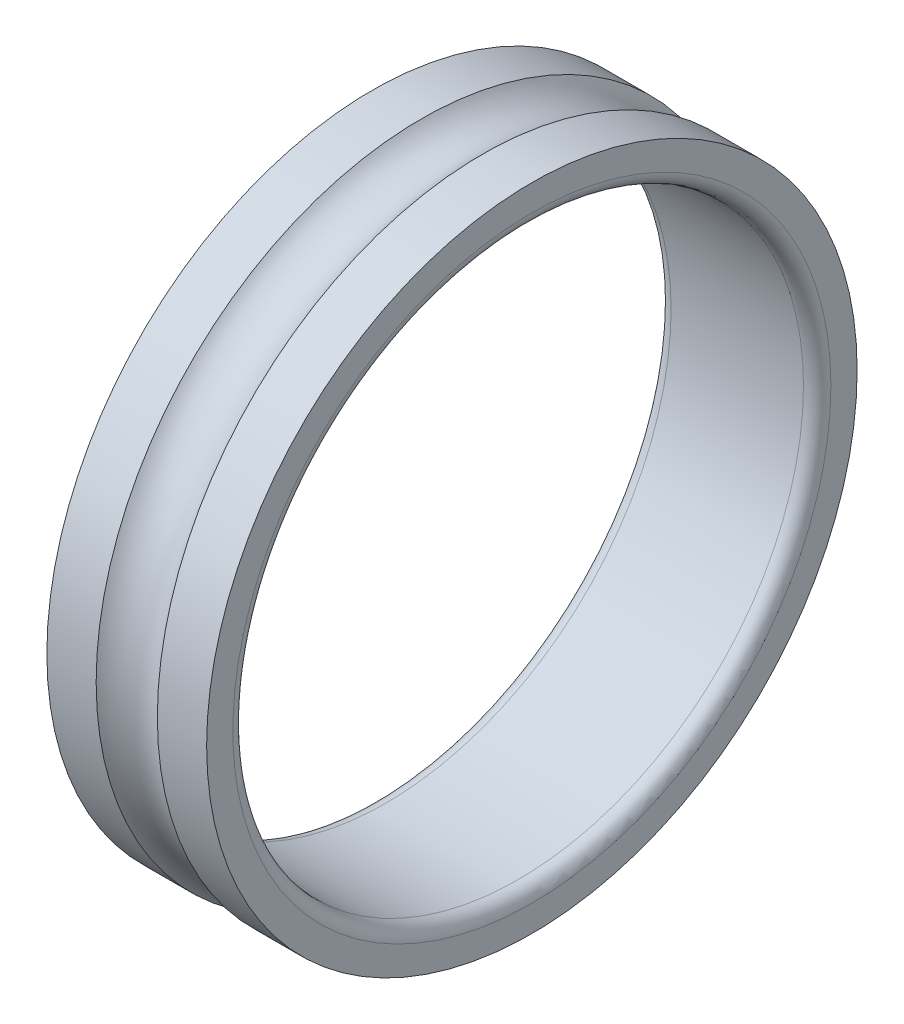
ISO-10303-21;
HEADER;
FILE_DESCRIPTION(('STEP AP214'),'2;1');
FILE_NAME('part.step','',(''),(''),'','','');
FILE_SCHEMA(('AUTOMOTIVE_DESIGN { 1 0 10303 214 1 1 1 1 }'));
ENDSEC;
DATA;
#1=APPLICATION_CONTEXT('core data for automotive mechanical design processes');
#2=APPLICATION_PROTOCOL_DEFINITION('international standard','automotive_design',2000,#1);
#3=PRODUCT_CONTEXT('',#1,'mechanical');
#4=PRODUCT('Part','Part','',(#3));
#5=PRODUCT_RELATED_PRODUCT_CATEGORY('part','',(#4));
#6=PRODUCT_DEFINITION_FORMATION('','',#4);
#7=PRODUCT_DEFINITION_CONTEXT('part definition',#1,'design');
#8=PRODUCT_DEFINITION('design','',#6,#7);
#9=PRODUCT_DEFINITION_SHAPE('','',#8);
#10=(LENGTH_UNIT() NAMED_UNIT(*) SI_UNIT(.MILLI.,.METRE.));
#11=(NAMED_UNIT(*) PLANE_ANGLE_UNIT() SI_UNIT($,.RADIAN.));
#12=(NAMED_UNIT(*) SI_UNIT($,.STERADIAN.) SOLID_ANGLE_UNIT());
#13=UNCERTAINTY_MEASURE_WITH_UNIT(LENGTH_MEASURE(1.E-05),#10,'distance_accuracy_value','');
#14=(GEOMETRIC_REPRESENTATION_CONTEXT(3) GLOBAL_UNCERTAINTY_ASSIGNED_CONTEXT((#13)) GLOBAL_UNIT_ASSIGNED_CONTEXT((#10,
#11,#12)) REPRESENTATION_CONTEXT('',''));
#15=CARTESIAN_POINT('',(0.,0.,0.));
#16=DIRECTION('',(0.,0.,1.));
#17=DIRECTION('',(1.,0.,0.));
#18=AXIS2_PLACEMENT_3D('',#15,#16,#17);
#19=CARTESIAN_POINT('',(3.5,0.,0.));
#20=DIRECTION('',(1.,0.,0.));
#21=DIRECTION('',(0.,0.,-1.));
#22=AXIS2_PLACEMENT_3D('',#19,#20,#21);
#23=TOROIDAL_SURFACE('',#22,15.375,1.75);
#24=CARTESIAN_POINT('',(2.15952433815455,0.,0.));
#25=DIRECTION('',(-1.,0.,0.));
#26=DIRECTION('',(0.,0.,1.));
#27=AXIS2_PLACEMENT_3D('',#24,#25,#26);
#28=CIRCLE('',#27,14.25);
#29=CARTESIAN_POINT('',(2.15952433815455,0.,14.25));
#30=VERTEX_POINT('',#29);
#31=EDGE_CURVE('E109',#30,#30,#28,.T.);
#32=ORIENTED_EDGE('',*,*,#31,.F.);
#33=EDGE_LOOP('',(#32));
#34=FACE_BOUND('',#33,.T.);
#35=CARTESIAN_POINT('',(4.84047566184545,0.,0.));
#36=DIRECTION('',(-1.,0.,0.));
#37=DIRECTION('',(0.,0.,1.));
#38=AXIS2_PLACEMENT_3D('',#35,#36,#37);
#39=CIRCLE('',#38,14.25);
#40=CARTESIAN_POINT('',(4.84047566184545,0.,14.25));
#41=VERTEX_POINT('',#40);
#42=EDGE_CURVE('E114',#41,#41,#39,.F.);
#43=ORIENTED_EDGE('',*,*,#42,.F.);
#44=EDGE_LOOP('',(#43));
#45=FACE_BOUND('',#44,.T.);
#46=ADVANCED_FACE('F14',(#34,#45),#23,.F.);
#47=CARTESIAN_POINT('',(50.,0.,0.));
#48=DIRECTION('',(-1.,0.,0.));
#49=DIRECTION('',(0.,0.,1.));
#50=AXIS2_PLACEMENT_3D('',#47,#48,#49);
#51=CYLINDRICAL_SURFACE('',#50,14.25);
#52=CARTESIAN_POINT('',(7.,0.,0.));
#53=DIRECTION('',(-1.,0.,0.));
#54=DIRECTION('',(0.,0.,1.));
#55=AXIS2_PLACEMENT_3D('',#52,#53,#54);
#56=CIRCLE('',#55,14.25);
#57=CARTESIAN_POINT('',(7.,0.,14.25));
#58=VERTEX_POINT('',#57);
#59=EDGE_CURVE('E18',#58,#58,#56,.F.);
#60=ORIENTED_EDGE('',*,*,#59,.F.);
#61=EDGE_LOOP('',(#60));
#62=FACE_BOUND('',#61,.T.);
#63=ORIENTED_EDGE('',*,*,#42,.T.);
#64=EDGE_LOOP('',(#63));
#65=FACE_BOUND('',#64,.T.);
#66=ADVANCED_FACE('F84',(#62,#65),#51,.T.);
#67=CARTESIAN_POINT('',(50.,0.,0.));
#68=DIRECTION('',(-1.,0.,0.));
#69=DIRECTION('',(0.,0.,1.));
#70=AXIS2_PLACEMENT_3D('',#67,#68,#69);
#71=CYLINDRICAL_SURFACE('',#70,14.25);
#72=ORIENTED_EDGE('',*,*,#31,.T.);
#73=EDGE_LOOP('',(#72));
#74=FACE_BOUND('',#73,.T.);
#75=CARTESIAN_POINT('',(0.,0.,0.));
#76=DIRECTION('',(-1.,0.,0.));
#77=DIRECTION('',(0.,0.,1.));
#78=AXIS2_PLACEMENT_3D('',#75,#76,#77);
#79=CIRCLE('',#78,14.25);
#80=CARTESIAN_POINT('',(0.,0.,14.25));
#81=VERTEX_POINT('',#80);
#82=EDGE_CURVE('E104',#81,#81,#79,.T.);
#83=ORIENTED_EDGE('',*,*,#82,.F.);
#84=EDGE_LOOP('',(#83));
#85=FACE_BOUND('',#84,.T.);
#86=ADVANCED_FACE('F81',(#74,#85),#71,.T.);
#87=CARTESIAN_POINT('',(7.,13.1,0.));
#88=DIRECTION('',(1.,0.,0.));
#89=DIRECTION('',(0.,0.,-1.));
#90=AXIS2_PLACEMENT_3D('',#87,#88,#89);
#91=PLANE('',#90);
#92=CARTESIAN_POINT('',(7.,0.,0.));
#93=DIRECTION('',(1.,0.,0.));
#94=DIRECTION('',(0.,0.,-1.));
#95=AXIS2_PLACEMENT_3D('',#92,#93,#94);
#96=CIRCLE('',#95,13.1000000089407);
#97=CARTESIAN_POINT('',(7.,0.,-13.1000000089407));
#98=VERTEX_POINT('',#97);
#99=EDGE_CURVE('E65',#98,#98,#96,.T.);
#100=ORIENTED_EDGE('',*,*,#99,.F.);
#101=EDGE_LOOP('',(#100));
#102=FACE_BOUND('',#101,.T.);
#103=ORIENTED_EDGE('',*,*,#59,.T.);
#104=EDGE_LOOP('',(#103));
#105=FACE_BOUND('',#104,.T.);
#106=ADVANCED_FACE('F71',(#102,#105),#91,.T.);
#107=CARTESIAN_POINT('',(0.,14.25,0.));
#108=DIRECTION('',(-1.,0.,0.));
#109=DIRECTION('',(0.,0.,1.));
#110=AXIS2_PLACEMENT_3D('',#107,#108,#109);
#111=PLANE('',#110);
#112=ORIENTED_EDGE('',*,*,#82,.T.);
#113=EDGE_LOOP('',(#112));
#114=FACE_BOUND('',#113,.T.);
#115=CARTESIAN_POINT('',(0.,0.,0.));
#116=DIRECTION('',(-1.,0.,0.));
#117=DIRECTION('',(0.,0.,-1.));
#118=AXIS2_PLACEMENT_3D('',#115,#116,#117);
#119=CIRCLE('',#118,13.1000000089407);
#120=CARTESIAN_POINT('',(0.,0.,-13.1000000089407));
#121=VERTEX_POINT('',#120);
#122=EDGE_CURVE('E27',#121,#121,#119,.T.);
#123=ORIENTED_EDGE('',*,*,#122,.F.);
#124=EDGE_LOOP('',(#123));
#125=FACE_BOUND('',#124,.T.);
#126=ADVANCED_FACE('F80',(#114,#125),#111,.T.);
#127=CARTESIAN_POINT('',(6.4,0.,0.));
#128=DIRECTION('',(1.,0.,0.));
#129=DIRECTION('',(0.,0.,-1.));
#130=AXIS2_PLACEMENT_3D('',#127,#128,#129);
#131=TOROIDAL_SURFACE('',#130,13.1,0.599999999999998);
#132=CARTESIAN_POINT('',(6.4,0.,0.));
#133=DIRECTION('',(-1.,0.,0.));
#134=DIRECTION('',(0.,0.,1.));
#135=AXIS2_PLACEMENT_3D('',#132,#133,#134);
#136=CIRCLE('',#135,12.5);
#137=CARTESIAN_POINT('',(6.4,0.,12.5));
#138=VERTEX_POINT('',#137);
#139=EDGE_CURVE('E22',#138,#138,#136,.T.);
#140=ORIENTED_EDGE('',*,*,#139,.T.);
#141=EDGE_LOOP('',(#140));
#142=FACE_BOUND('',#141,.T.);
#143=ORIENTED_EDGE('',*,*,#99,.T.);
#144=EDGE_LOOP('',(#143));
#145=FACE_BOUND('',#144,.T.);
#146=ADVANCED_FACE('F45',(#142,#145),#131,.T.);
#147=CARTESIAN_POINT('',(0.599999999999998,0.,0.));
#148=DIRECTION('',(1.,0.,0.));
#149=DIRECTION('',(0.,0.,-1.));
#150=AXIS2_PLACEMENT_3D('',#147,#148,#149);
#151=TOROIDAL_SURFACE('',#150,13.1,0.599999999999998);
#152=ORIENTED_EDGE('',*,*,#122,.T.);
#153=EDGE_LOOP('',(#152));
#154=FACE_BOUND('',#153,.T.);
#155=CARTESIAN_POINT('',(0.599999999999996,0.,0.));
#156=DIRECTION('',(-1.,0.,0.));
#157=DIRECTION('',(0.,0.,1.));
#158=AXIS2_PLACEMENT_3D('',#155,#156,#157);
#159=CIRCLE('',#158,12.5);
#160=CARTESIAN_POINT('',(0.599999999999996,0.,12.5));
#161=VERTEX_POINT('',#160);
#162=EDGE_CURVE('E10',#161,#161,#159,.F.);
#163=ORIENTED_EDGE('',*,*,#162,.T.);
#164=EDGE_LOOP('',(#163));
#165=FACE_BOUND('',#164,.T.);
#166=ADVANCED_FACE('F39',(#154,#165),#151,.T.);
#167=CARTESIAN_POINT('',(50.,0.,0.));
#168=DIRECTION('',(-1.,0.,0.));
#169=DIRECTION('',(0.,0.,1.));
#170=AXIS2_PLACEMENT_3D('',#167,#168,#169);
#171=CYLINDRICAL_SURFACE('',#170,12.5);
#172=ORIENTED_EDGE('',*,*,#162,.F.);
#173=EDGE_LOOP('',(#172));
#174=FACE_BOUND('',#173,.T.);
#175=ORIENTED_EDGE('',*,*,#139,.F.);
#176=EDGE_LOOP('',(#175));
#177=FACE_BOUND('',#176,.T.);
#178=ADVANCED_FACE('F44',(#174,#177),#171,.F.);
#179=CLOSED_SHELL('',(#46,#66,#86,#106,#126,#146,#166,#178));
#180=MANIFOLD_SOLID_BREP('B1',#179);
#181=ADVANCED_BREP_SHAPE_REPRESENTATION('',(#18,#180),#14);
#182=SHAPE_DEFINITION_REPRESENTATION(#9,#181);
ENDSEC;
END-ISO-10303-21;
